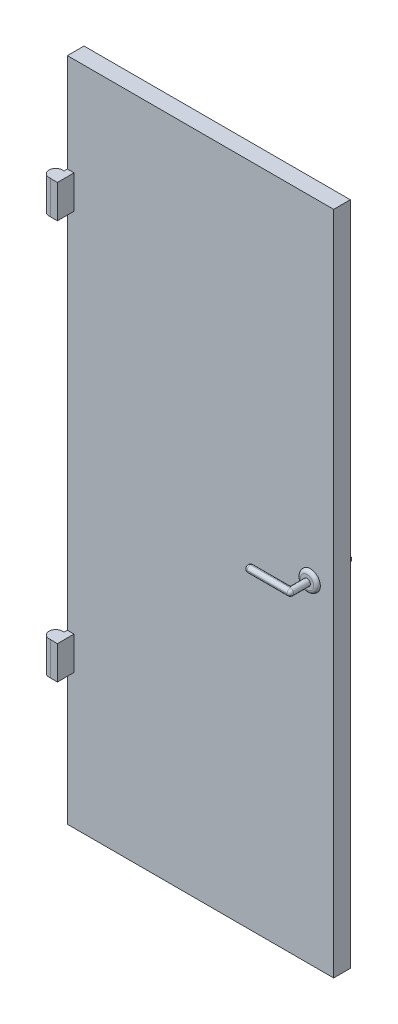
ISO-10303-21;
HEADER;
FILE_DESCRIPTION(('STEP AP214'),'2;1');
FILE_NAME('part.step','',(''),(''),'','','');
FILE_SCHEMA(('AUTOMOTIVE_DESIGN { 1 0 10303 214 1 1 1 1 }'));
ENDSEC;
DATA;
#1=APPLICATION_CONTEXT('core data for automotive mechanical design processes');
#2=APPLICATION_PROTOCOL_DEFINITION('international standard','automotive_design',2000,#1);
#3=PRODUCT_CONTEXT('',#1,'mechanical');
#4=PRODUCT('Part','Part','',(#3));
#5=PRODUCT_RELATED_PRODUCT_CATEGORY('part','',(#4));
#6=PRODUCT_DEFINITION_FORMATION('','',#4);
#7=PRODUCT_DEFINITION_CONTEXT('part definition',#1,'design');
#8=PRODUCT_DEFINITION('design','',#6,#7);
#9=PRODUCT_DEFINITION_SHAPE('','',#8);
#10=(LENGTH_UNIT() NAMED_UNIT(*) SI_UNIT(.MILLI.,.METRE.));
#11=(NAMED_UNIT(*) PLANE_ANGLE_UNIT() SI_UNIT($,.RADIAN.));
#12=(NAMED_UNIT(*) SI_UNIT($,.STERADIAN.) SOLID_ANGLE_UNIT());
#13=UNCERTAINTY_MEASURE_WITH_UNIT(LENGTH_MEASURE(1.E-05),#10,'distance_accuracy_value','');
#14=(GEOMETRIC_REPRESENTATION_CONTEXT(3) GLOBAL_UNCERTAINTY_ASSIGNED_CONTEXT((#13)) GLOBAL_UNIT_ASSIGNED_CONTEXT((#10,
#11,#12)) REPRESENTATION_CONTEXT('',''));
#15=CARTESIAN_POINT('',(0.,0.,0.));
#16=DIRECTION('',(0.,0.,1.));
#17=DIRECTION('',(1.,0.,0.));
#18=AXIS2_PLACEMENT_3D('',#15,#16,#17);
#19=CARTESIAN_POINT('',(0.,2000.,50.0000000000071));
#20=DIRECTION('',(-1.,0.,0.));
#21=DIRECTION('',(0.,0.,1.));
#22=AXIS2_PLACEMENT_3D('',#19,#20,#21);
#23=PLANE('',#22);
#24=DIRECTION('',(0.,0.,-1.));
#25=VECTOR('',#24,1.);
#26=CARTESIAN_POINT('',(0.,2000.,50.0000000000071));
#27=LINE('',#26,#25);
#28=CARTESIAN_POINT('',(0.,2000.,50.0000000000071));
#29=VERTEX_POINT('',#28);
#30=CARTESIAN_POINT('',(0.,2000.,7.105427357601E-12));
#31=VERTEX_POINT('',#30);
#32=EDGE_CURVE('E362',#29,#31,#27,.T.);
#33=ORIENTED_EDGE('',*,*,#32,.T.);
#34=DIRECTION('',(0.,1.,0.));
#35=VECTOR('',#34,1.);
#36=CARTESIAN_POINT('',(0.,2000.,7.105427357601E-12));
#37=LINE('',#36,#35);
#38=CARTESIAN_POINT('',(0.,0.,7.105427357601E-12));
#39=VERTEX_POINT('',#38);
#40=EDGE_CURVE('E354',#39,#31,#37,.T.);
#41=ORIENTED_EDGE('',*,*,#40,.F.);
#42=DIRECTION('',(0.,0.,-1.));
#43=VECTOR('',#42,1.);
#44=CARTESIAN_POINT('',(0.,0.,50.0000000000071));
#45=LINE('',#44,#43);
#46=CARTESIAN_POINT('',(0.,0.,50.0000000000071));
#47=VERTEX_POINT('',#46);
#48=EDGE_CURVE('E366',#47,#39,#45,.T.);
#49=ORIENTED_EDGE('',*,*,#48,.F.);
#50=DIRECTION('',(0.,1.,0.));
#51=VECTOR('',#50,1.);
#52=CARTESIAN_POINT('',(0.,2000.,50.0000000000071));
#53=LINE('',#52,#51);
#54=CARTESIAN_POINT('',(0.,405.,49.9999999999932));
#55=VERTEX_POINT('',#54);
#56=EDGE_CURVE('E337',#47,#55,#53,.T.);
#57=ORIENTED_EDGE('',*,*,#56,.T.);
#58=DIRECTION('',(0.,0.,-1.));
#59=VECTOR('',#58,1.);
#60=CARTESIAN_POINT('',(0.,405.,99.9999999999932));
#61=LINE('',#60,#59);
#62=CARTESIAN_POINT('',(0.,405.,60.6350832689759));
#63=VERTEX_POINT('',#62);
#64=EDGE_CURVE('E241',#63,#55,#61,.T.);
#65=ORIENTED_EDGE('',*,*,#64,.F.);
#66=DIRECTION('',(0.,-1.,0.));
#67=VECTOR('',#66,1.);
#68=CARTESIAN_POINT('',(0.,505.,60.6350832689759));
#69=LINE('',#68,#67);
#70=CARTESIAN_POINT('',(0.,505.,60.6350832689759));
#71=VERTEX_POINT('',#70);
#72=EDGE_CURVE('E211',#63,#71,#69,.F.);
#73=ORIENTED_EDGE('',*,*,#72,.T.);
#74=DIRECTION('',(0.,0.,-1.));
#75=VECTOR('',#74,1.);
#76=CARTESIAN_POINT('',(0.,505.,99.9999999999932));
#77=LINE('',#76,#75);
#78=CARTESIAN_POINT('',(0.,505.,49.9999999999932));
#79=VERTEX_POINT('',#78);
#80=EDGE_CURVE('E220',#71,#79,#77,.T.);
#81=ORIENTED_EDGE('',*,*,#80,.T.);
#82=CARTESIAN_POINT('',(0.,1605.,50.0000000000142));
#83=VERTEX_POINT('',#82);
#84=EDGE_CURVE('E342',#79,#83,#53,.T.);
#85=ORIENTED_EDGE('',*,*,#84,.T.);
#86=DIRECTION('',(0.,0.,-1.));
#87=VECTOR('',#86,1.);
#88=CARTESIAN_POINT('',(0.,1605.,100.000000000014));
#89=LINE('',#88,#87);
#90=CARTESIAN_POINT('',(0.,1605.,60.635083268997));
#91=VERTEX_POINT('',#90);
#92=EDGE_CURVE('E300',#91,#83,#89,.T.);
#93=ORIENTED_EDGE('',*,*,#92,.F.);
#94=DIRECTION('',(0.,-1.,0.));
#95=VECTOR('',#94,1.);
#96=CARTESIAN_POINT('',(0.,1705.,60.635083268997));
#97=LINE('',#96,#95);
#98=CARTESIAN_POINT('',(0.,1705.,60.635083268997));
#99=VERTEX_POINT('',#98);
#100=EDGE_CURVE('E256',#91,#99,#97,.F.);
#101=ORIENTED_EDGE('',*,*,#100,.T.);
#102=DIRECTION('',(0.,0.,-1.));
#103=VECTOR('',#102,1.);
#104=CARTESIAN_POINT('',(0.,1705.,100.000000000014));
#105=LINE('',#104,#103);
#106=CARTESIAN_POINT('',(0.,1705.,50.0000000000142));
#107=VERTEX_POINT('',#106);
#108=EDGE_CURVE('E278',#99,#107,#105,.T.);
#109=ORIENTED_EDGE('',*,*,#108,.T.);
#110=EDGE_CURVE('E336',#107,#29,#53,.T.);
#111=ORIENTED_EDGE('',*,*,#110,.T.);
#112=EDGE_LOOP('',(#33,#41,#49,#57,#65,#73,#81,#85,#93,#101,#109,#111));
#113=FACE_BOUND('',#112,.T.);
#114=ADVANCED_FACE('F41',(#113),#23,.T.);
#115=CARTESIAN_POINT('',(0.,505.,99.9999999999932));
#116=VERTEX_POINT('',#115);
#117=CARTESIAN_POINT('',(0.,505.,99.3649167310388));
#118=VERTEX_POINT('',#117);
#119=EDGE_CURVE('E217',#116,#118,#77,.T.);
#120=ORIENTED_EDGE('',*,*,#119,.T.);
#121=DIRECTION('',(0.,-1.,0.));
#122=VECTOR('',#121,1.);
#123=CARTESIAN_POINT('',(0.,505.,99.3649167310388));
#124=LINE('',#123,#122);
#125=CARTESIAN_POINT('',(0.,405.,99.3649167310388));
#126=VERTEX_POINT('',#125);
#127=EDGE_CURVE('E203',#118,#126,#124,.T.);
#128=ORIENTED_EDGE('',*,*,#127,.T.);
#129=CARTESIAN_POINT('',(0.,405.,99.9999999999932));
#130=VERTEX_POINT('',#129);
#131=EDGE_CURVE('E242',#130,#126,#61,.T.);
#132=ORIENTED_EDGE('',*,*,#131,.F.);
#133=DIRECTION('',(0.,1.,0.));
#134=VECTOR('',#133,1.);
#135=CARTESIAN_POINT('',(0.,405.,99.9999999999932));
#136=LINE('',#135,#134);
#137=EDGE_CURVE('E225',#130,#116,#136,.T.);
#138=ORIENTED_EDGE('',*,*,#137,.T.);
#139=EDGE_LOOP('',(#120,#128,#132,#138));
#140=FACE_BOUND('',#139,.T.);
#141=ADVANCED_FACE('F223',(#140),#23,.T.);
#142=CARTESIAN_POINT('',(0.,1705.,100.000000000014));
#143=VERTEX_POINT('',#142);
#144=CARTESIAN_POINT('',(0.,1705.,99.3649167310599));
#145=VERTEX_POINT('',#144);
#146=EDGE_CURVE('E289',#143,#145,#105,.T.);
#147=ORIENTED_EDGE('',*,*,#146,.T.);
#148=DIRECTION('',(0.,-1.,0.));
#149=VECTOR('',#148,1.);
#150=CARTESIAN_POINT('',(0.,1705.,99.3649167310599));
#151=LINE('',#150,#149);
#152=CARTESIAN_POINT('',(0.,1605.,99.3649167310599));
#153=VERTEX_POINT('',#152);
#154=EDGE_CURVE('E250',#145,#153,#151,.T.);
#155=ORIENTED_EDGE('',*,*,#154,.T.);
#156=CARTESIAN_POINT('',(0.,1605.,100.000000000014));
#157=VERTEX_POINT('',#156);
#158=EDGE_CURVE('E301',#157,#153,#89,.T.);
#159=ORIENTED_EDGE('',*,*,#158,.F.);
#160=DIRECTION('',(0.,1.,0.));
#161=VECTOR('',#160,1.);
#162=CARTESIAN_POINT('',(0.,1605.,100.000000000014));
#163=LINE('',#162,#161);
#164=EDGE_CURVE('E261',#157,#143,#163,.T.);
#165=ORIENTED_EDGE('',*,*,#164,.T.);
#166=EDGE_LOOP('',(#147,#155,#159,#165));
#167=FACE_BOUND('',#166,.T.);
#168=ADVANCED_FACE('F509',(#167),#23,.T.);
#169=CARTESIAN_POINT('',(0.,0.,7.105427357601E-12));
#170=DIRECTION('',(0.,0.,-1.));
#171=DIRECTION('',(-1.,0.,0.));
#172=AXIS2_PLACEMENT_3D('',#169,#170,#171);
#173=PLANE('',#172);
#174=CARTESIAN_POINT('',(730.000000000004,1000.,0.));
#175=DIRECTION('',(0.,0.,-1.));
#176=DIRECTION('',(-1.,0.,0.));
#177=AXIS2_PLACEMENT_3D('',#174,#175,#176);
#178=CIRCLE('',#177,30.0000000000001);
#179=CARTESIAN_POINT('',(700.000000000004,1000.,0.));
#180=VERTEX_POINT('',#179);
#181=EDGE_CURVE('E321',#180,#180,#178,.T.);
#182=ORIENTED_EDGE('',*,*,#181,.F.);
#183=EDGE_LOOP('',(#182));
#184=FACE_BOUND('',#183,.T.);
#185=ORIENTED_EDGE('',*,*,#40,.T.);
#186=DIRECTION('',(1.,0.,0.));
#187=VECTOR('',#186,1.);
#188=CARTESIAN_POINT('',(800.000000000004,2000.,7.105427357601E-12));
#189=LINE('',#188,#187);
#190=CARTESIAN_POINT('',(800.000000000004,2000.,7.105427357601E-12));
#191=VERTEX_POINT('',#190);
#192=EDGE_CURVE('E332',#31,#191,#189,.T.);
#193=ORIENTED_EDGE('',*,*,#192,.T.);
#194=DIRECTION('',(0.,-1.,0.));
#195=VECTOR('',#194,1.);
#196=CARTESIAN_POINT('',(800.000000000004,2000.,7.105427357601E-12));
#197=LINE('',#196,#195);
#198=CARTESIAN_POINT('',(800.000000000004,0.,7.105427357601E-12));
#199=VERTEX_POINT('',#198);
#200=EDGE_CURVE('E325',#191,#199,#197,.T.);
#201=ORIENTED_EDGE('',*,*,#200,.T.);
#202=DIRECTION('',(-1.,0.,0.));
#203=VECTOR('',#202,1.);
#204=CARTESIAN_POINT('',(800.000000000004,0.,7.105427357601E-12));
#205=LINE('',#204,#203);
#206=EDGE_CURVE('E350',#199,#39,#205,.T.);
#207=ORIENTED_EDGE('',*,*,#206,.T.);
#208=EDGE_LOOP('',(#185,#193,#201,#207));
#209=FACE_BOUND('',#208,.T.);
#210=ADVANCED_FACE('F516',(#184,#209),#173,.T.);
#211=CARTESIAN_POINT('',(800.000000000004,2000.,50.0000000000071));
#212=DIRECTION('',(1.,0.,0.));
#213=DIRECTION('',(0.,0.,-1.));
#214=AXIS2_PLACEMENT_3D('',#211,#212,#213);
#215=PLANE('',#214);
#216=ORIENTED_EDGE('',*,*,#200,.F.);
#217=DIRECTION('',(0.,0.,-1.));
#218=VECTOR('',#217,1.);
#219=CARTESIAN_POINT('',(800.000000000004,2000.,50.0000000000071));
#220=LINE('',#219,#218);
#221=CARTESIAN_POINT('',(800.000000000004,2000.,50.0000000000071));
#222=VERTEX_POINT('',#221);
#223=EDGE_CURVE('E320',#222,#191,#220,.T.);
#224=ORIENTED_EDGE('',*,*,#223,.F.);
#225=DIRECTION('',(0.,-1.,0.));
#226=VECTOR('',#225,1.);
#227=CARTESIAN_POINT('',(800.000000000004,2000.,50.0000000000071));
#228=LINE('',#227,#226);
#229=CARTESIAN_POINT('',(800.000000000004,0.,50.0000000000071));
#230=VERTEX_POINT('',#229);
#231=EDGE_CURVE('E327',#222,#230,#228,.T.);
#232=ORIENTED_EDGE('',*,*,#231,.T.);
#233=DIRECTION('',(0.,0.,-1.));
#234=VECTOR('',#233,1.);
#235=CARTESIAN_POINT('',(800.000000000004,0.,50.0000000000071));
#236=LINE('',#235,#234);
#237=EDGE_CURVE('E346',#230,#199,#236,.T.);
#238=ORIENTED_EDGE('',*,*,#237,.T.);
#239=EDGE_LOOP('',(#216,#224,#232,#238));
#240=FACE_BOUND('',#239,.T.);
#241=ADVANCED_FACE('F521',(#240),#215,.T.);
#242=CARTESIAN_POINT('',(800.000000000004,2000.,50.0000000000071));
#243=DIRECTION('',(0.,1.,0.));
#244=DIRECTION('',(0.,0.,1.));
#245=AXIS2_PLACEMENT_3D('',#242,#243,#244);
#246=PLANE('',#245);
#247=ORIENTED_EDGE('',*,*,#192,.F.);
#248=ORIENTED_EDGE('',*,*,#32,.F.);
#249=DIRECTION('',(1.,0.,0.));
#250=VECTOR('',#249,1.);
#251=CARTESIAN_POINT('',(800.000000000004,2000.,50.0000000000071));
#252=LINE('',#251,#250);
#253=EDGE_CURVE('E341',#29,#222,#252,.T.);
#254=ORIENTED_EDGE('',*,*,#253,.T.);
#255=ORIENTED_EDGE('',*,*,#223,.T.);
#256=EDGE_LOOP('',(#247,#248,#254,#255));
#257=FACE_BOUND('',#256,.T.);
#258=ADVANCED_FACE('F563',(#257),#246,.T.);
#259=CARTESIAN_POINT('',(800.000000000004,0.,50.0000000000071));
#260=DIRECTION('',(0.,-1.,0.));
#261=DIRECTION('',(0.,0.,-1.));
#262=AXIS2_PLACEMENT_3D('',#259,#260,#261);
#263=PLANE('',#262);
#264=ORIENTED_EDGE('',*,*,#206,.F.);
#265=ORIENTED_EDGE('',*,*,#237,.F.);
#266=DIRECTION('',(-1.,0.,0.));
#267=VECTOR('',#266,1.);
#268=CARTESIAN_POINT('',(800.000000000004,0.,50.0000000000071));
#269=LINE('',#268,#267);
#270=EDGE_CURVE('E331',#230,#47,#269,.T.);
#271=ORIENTED_EDGE('',*,*,#270,.T.);
#272=ORIENTED_EDGE('',*,*,#48,.T.);
#273=EDGE_LOOP('',(#264,#265,#271,#272));
#274=FACE_BOUND('',#273,.T.);
#275=ADVANCED_FACE('F556',(#274),#263,.T.);
#276=CARTESIAN_POINT('',(0.,0.,50.0000000000071));
#277=DIRECTION('',(0.,0.,-1.));
#278=DIRECTION('',(-1.,0.,0.));
#279=AXIS2_PLACEMENT_3D('',#276,#277,#278);
#280=PLANE('',#279);
#281=CARTESIAN_POINT('',(730.000000000004,1000.,50.0000000000141));
#282=DIRECTION('',(0.,0.,-1.));
#283=DIRECTION('',(-1.,0.,0.));
#284=AXIS2_PLACEMENT_3D('',#281,#282,#283);
#285=CIRCLE('',#284,30.0000000000001);
#286=CARTESIAN_POINT('',(700.000000000004,1000.,50.0000000000141));
#287=VERTEX_POINT('',#286);
#288=EDGE_CURVE('E310',#287,#287,#285,.T.);
#289=ORIENTED_EDGE('',*,*,#288,.T.);
#290=EDGE_LOOP('',(#289));
#291=FACE_BOUND('',#290,.T.);
#292=DIRECTION('',(0.,-1.,0.));
#293=VECTOR('',#292,1.);
#294=CARTESIAN_POINT('',(20.0000000000031,405.,49.9999999999932));
#295=LINE('',#294,#293);
#296=CARTESIAN_POINT('',(20.0000000000031,505.,50.0000000000071));
#297=VERTEX_POINT('',#296);
#298=CARTESIAN_POINT('',(20.0000000000031,405.,49.9999999999932));
#299=VERTEX_POINT('',#298);
#300=EDGE_CURVE('E67',#297,#299,#295,.T.);
#301=ORIENTED_EDGE('',*,*,#300,.T.);
#302=DIRECTION('',(-1.,0.,0.));
#303=VECTOR('',#302,1.);
#304=CARTESIAN_POINT('',(0.,405.,49.9999999999932));
#305=LINE('',#304,#303);
#306=EDGE_CURVE('E545',#299,#55,#305,.T.);
#307=ORIENTED_EDGE('',*,*,#306,.T.);
#308=ORIENTED_EDGE('',*,*,#56,.F.);
#309=ORIENTED_EDGE('',*,*,#270,.F.);
#310=ORIENTED_EDGE('',*,*,#231,.F.);
#311=ORIENTED_EDGE('',*,*,#253,.F.);
#312=ORIENTED_EDGE('',*,*,#110,.F.);
#313=DIRECTION('',(1.,0.,0.));
#314=VECTOR('',#313,1.);
#315=CARTESIAN_POINT('',(0.,1705.,50.0000000000142));
#316=LINE('',#315,#314);
#317=CARTESIAN_POINT('',(20.0000000000031,1705.,50.0000000000071));
#318=VERTEX_POINT('',#317);
#319=EDGE_CURVE('E266',#107,#318,#316,.T.);
#320=ORIENTED_EDGE('',*,*,#319,.T.);
#321=DIRECTION('',(0.,-1.,0.));
#322=VECTOR('',#321,1.);
#323=CARTESIAN_POINT('',(20.0000000000031,1605.,50.0000000000142));
#324=LINE('',#323,#322);
#325=CARTESIAN_POINT('',(20.0000000000031,1605.,50.0000000000142));
#326=VERTEX_POINT('',#325);
#327=EDGE_CURVE('E282',#318,#326,#324,.T.);
#328=ORIENTED_EDGE('',*,*,#327,.T.);
#329=DIRECTION('',(-1.,0.,0.));
#330=VECTOR('',#329,1.);
#331=CARTESIAN_POINT('',(0.,1605.,50.0000000000142));
#332=LINE('',#331,#330);
#333=EDGE_CURVE('E260',#326,#83,#332,.T.);
#334=ORIENTED_EDGE('',*,*,#333,.T.);
#335=ORIENTED_EDGE('',*,*,#84,.F.);
#336=DIRECTION('',(1.,0.,0.));
#337=VECTOR('',#336,1.);
#338=CARTESIAN_POINT('',(0.,505.,49.9999999999932));
#339=LINE('',#338,#337);
#340=EDGE_CURVE('E236',#79,#297,#339,.T.);
#341=ORIENTED_EDGE('',*,*,#340,.T.);
#342=EDGE_LOOP('',(#301,#307,#308,#309,#310,#311,#312,#320,#328,#334,#335,#341));
#343=FACE_BOUND('',#342,.T.);
#344=ADVANCED_FACE('F548',(#291,#343),#280,.F.);
#345=CARTESIAN_POINT('',(730.000000000004,1000.,-9.99999999999992));
#346=DIRECTION('',(0.,0.,-1.));
#347=DIRECTION('',(-1.,0.,0.));
#348=AXIS2_PLACEMENT_3D('',#345,#346,#347);
#349=PLANE('',#348);
#350=CARTESIAN_POINT('',(730.000000000004,1000.,-9.99999999999992));
#351=DIRECTION('',(0.,0.,-1.));
#352=DIRECTION('',(-1.,0.,0.));
#353=AXIS2_PLACEMENT_3D('',#350,#351,#352);
#354=CIRCLE('',#353,20.0000000000001);
#355=CARTESIAN_POINT('',(710.000000000004,1000.,-9.99999999999992));
#356=VERTEX_POINT('',#355);
#357=EDGE_CURVE('E373',#356,#356,#354,.T.);
#358=ORIENTED_EDGE('',*,*,#357,.T.);
#359=EDGE_LOOP('',(#358));
#360=FACE_BOUND('',#359,.T.);
#361=CARTESIAN_POINT('',(730.000000000004,1000.,-9.99999999999992));
#362=DIRECTION('',(0.,0.,-1.));
#363=DIRECTION('',(-1.,0.,0.));
#364=AXIS2_PLACEMENT_3D('',#361,#362,#363);
#365=CIRCLE('',#364,9.99999999999998);
#366=CARTESIAN_POINT('',(720.000000000004,1000.,-9.99999999999992));
#367=VERTEX_POINT('',#366);
#368=EDGE_CURVE('E315',#367,#367,#365,.T.);
#369=ORIENTED_EDGE('',*,*,#368,.F.);
#370=EDGE_LOOP('',(#369));
#371=FACE_BOUND('',#370,.T.);
#372=ADVANCED_FACE('F628',(#360,#371),#349,.T.);
#373=CARTESIAN_POINT('',(730.000000000004,1000.,-49.9999999999999));
#374=DIRECTION('',(0.,0.,1.));
#375=DIRECTION('',(1.,0.,0.));
#376=AXIS2_PLACEMENT_3D('',#373,#374,#375);
#377=CYLINDRICAL_SURFACE('',#376,9.99999999999998);
#378=CARTESIAN_POINT('',(730.000000000004,1000.,-59.9999999999999));
#379=DIRECTION('',(0.707106781186547,0.,0.707106781186548));
#380=DIRECTION('',(-0.707106781186548,0.,0.707106781186547));
#381=AXIS2_PLACEMENT_3D('',#378,#379,#380);
#382=ELLIPSE('',#381,14.1421356237309,9.99999999999999);
#383=CARTESIAN_POINT('',(730.000000000004,1010.,-59.9999999999999));
#384=VERTEX_POINT('',#383);
#385=CARTESIAN_POINT('',(720.000000000004,1000.,-49.9999999999999));
#386=VERTEX_POINT('',#385);
#387=EDGE_CURVE('E377',#384,#386,#382,.T.);
#388=ORIENTED_EDGE('',*,*,#387,.T.);
#389=CARTESIAN_POINT('',(730.000000000004,1000.,-59.9999999999999));
#390=DIRECTION('',(0.707106781186547,0.,0.707106781186548));
#391=DIRECTION('',(-0.707106781186548,0.,0.707106781186547));
#392=AXIS2_PLACEMENT_3D('',#389,#390,#391);
#393=ELLIPSE('',#392,14.1421356237309,9.99999999999999);
#394=CARTESIAN_POINT('',(730.000000000004,990.,-59.9999999999999));
#395=VERTEX_POINT('',#394);
#396=EDGE_CURVE('E381',#386,#395,#393,.T.);
#397=ORIENTED_EDGE('',*,*,#396,.T.);
#398=CARTESIAN_POINT('',(730.000000000004,1000.,-59.9999999999999));
#399=DIRECTION('',(0.,0.,1.));
#400=DIRECTION('',(1.,0.,0.));
#401=AXIS2_PLACEMENT_3D('',#398,#399,#400);
#402=CIRCLE('',#401,9.99999999999998);
#403=EDGE_CURVE('E319',#395,#384,#402,.T.);
#404=ORIENTED_EDGE('',*,*,#403,.T.);
#405=EDGE_LOOP('',(#388,#397,#404));
#406=FACE_BOUND('',#405,.T.);
#407=ORIENTED_EDGE('',*,*,#368,.T.);
#408=EDGE_LOOP('',(#407));
#409=FACE_BOUND('',#408,.T.);
#410=ADVANCED_FACE('F624',(#406,#409),#377,.T.);
#411=CARTESIAN_POINT('',(610.000000000004,1000.,-59.9999999999999));
#412=DIRECTION('',(0.,0.,-1.));
#413=DIRECTION('',(-1.,0.,0.));
#414=AXIS2_PLACEMENT_3D('',#411,#412,#413);
#415=SPHERICAL_SURFACE('',#414,10.);
#416=CARTESIAN_POINT('',(610.000000000004,1000.,-59.9999999999999));
#417=DIRECTION('',(1.,0.,0.));
#418=DIRECTION('',(0.,0.,-1.));
#419=AXIS2_PLACEMENT_3D('',#416,#417,#418);
#420=CIRCLE('',#419,10.);
#421=CARTESIAN_POINT('',(610.000000000004,990.,-59.9999999999999));
#422=VERTEX_POINT('',#421);
#423=CARTESIAN_POINT('',(610.000000000004,1000.,-69.9999999999999));
#424=VERTEX_POINT('',#423);
#425=EDGE_CURVE('E326',#422,#424,#420,.T.);
#426=ORIENTED_EDGE('',*,*,#425,.F.);
#427=CARTESIAN_POINT('',(610.000000000004,1000.,-59.9999999999999));
#428=DIRECTION('',(0.,0.,1.));
#429=DIRECTION('',(1.,0.,0.));
#430=AXIS2_PLACEMENT_3D('',#427,#428,#429);
#431=CIRCLE('',#430,9.99999999999979);
#432=CARTESIAN_POINT('',(610.000000000004,1010.,-59.9999999999999));
#433=VERTEX_POINT('',#432);
#434=EDGE_CURVE('E407',#433,#422,#431,.T.);
#435=ORIENTED_EDGE('',*,*,#434,.F.);
#436=CARTESIAN_POINT('',(610.000000000004,1000.,-59.9999999999999));
#437=DIRECTION('',(1.,0.,0.));
#438=DIRECTION('',(0.,0.,-1.));
#439=AXIS2_PLACEMENT_3D('',#436,#437,#438);
#440=CIRCLE('',#439,10.);
#441=EDGE_CURVE('E403',#424,#433,#440,.T.);
#442=ORIENTED_EDGE('',*,*,#441,.F.);
#443=EDGE_LOOP('',(#426,#435,#442));
#444=FACE_BOUND('',#443,.T.);
#445=ADVANCED_FACE('F627',(#444),#415,.T.);
#446=CARTESIAN_POINT('',(730.000000000004,1000.,-59.9999999999999));
#447=DIRECTION('',(1.,0.,0.));
#448=DIRECTION('',(0.,1.,0.));
#449=AXIS2_PLACEMENT_3D('',#446,#447,#448);
#450=CYLINDRICAL_SURFACE('',#449,10.);
#451=CARTESIAN_POINT('',(730.000000000004,1000.,-59.9999999999999));
#452=DIRECTION('',(1.,0.,0.));
#453=DIRECTION('',(0.,0.,-1.));
#454=AXIS2_PLACEMENT_3D('',#451,#452,#453);
#455=CIRCLE('',#454,10.);
#456=CARTESIAN_POINT('',(730.000000000004,1000.,-69.9999999999999));
#457=VERTEX_POINT('',#456);
#458=EDGE_CURVE('E418',#395,#457,#455,.T.);
#459=ORIENTED_EDGE('',*,*,#458,.F.);
#460=DIRECTION('',(-1.,0.,0.));
#461=VECTOR('',#460,1.);
#462=CARTESIAN_POINT('',(730.000000000004,990.,-59.9999999999999));
#463=LINE('',#462,#461);
#464=EDGE_CURVE('E414',#422,#395,#463,.F.);
#465=ORIENTED_EDGE('',*,*,#464,.F.);
#466=ORIENTED_EDGE('',*,*,#425,.T.);
#467=DIRECTION('',(-1.,0.,0.));
#468=VECTOR('',#467,1.);
#469=CARTESIAN_POINT('',(610.000000000004,1000.,-69.9999999999999));
#470=LINE('',#469,#468);
#471=EDGE_CURVE('E399',#457,#424,#470,.T.);
#472=ORIENTED_EDGE('',*,*,#471,.F.);
#473=EDGE_LOOP('',(#459,#465,#466,#472));
#474=FACE_BOUND('',#473,.T.);
#475=ADVANCED_FACE('F663',(#474),#450,.T.);
#476=CARTESIAN_POINT('',(730.000000000004,1000.,-59.9999999999999));
#477=DIRECTION('',(0.,0.,-1.));
#478=DIRECTION('',(-1.,0.,0.));
#479=AXIS2_PLACEMENT_3D('',#476,#477,#478);
#480=SPHERICAL_SURFACE('',#479,10.);
#481=ORIENTED_EDGE('',*,*,#403,.F.);
#482=ORIENTED_EDGE('',*,*,#458,.T.);
#483=CARTESIAN_POINT('',(730.000000000004,1000.,-59.9999999999999));
#484=DIRECTION('',(-1.,0.,0.));
#485=DIRECTION('',(0.,0.,1.));
#486=AXIS2_PLACEMENT_3D('',#483,#484,#485);
#487=CIRCLE('',#486,10.);
#488=EDGE_CURVE('E395',#384,#457,#487,.T.);
#489=ORIENTED_EDGE('',*,*,#488,.F.);
#490=EDGE_LOOP('',(#481,#482,#489));
#491=FACE_BOUND('',#490,.T.);
#492=ADVANCED_FACE('F659',(#491),#480,.T.);
#493=CARTESIAN_POINT('',(730.000000000004,1000.,-59.9999999999999));
#494=DIRECTION('',(-1.,0.,0.));
#495=DIRECTION('',(0.,-1.,0.));
#496=AXIS2_PLACEMENT_3D('',#493,#494,#495);
#497=CYLINDRICAL_SURFACE('',#496,10.);
#498=CARTESIAN_POINT('',(610.000000000004,1000.,-59.9999999999999));
#499=DIRECTION('',(-1.,0.,0.));
#500=DIRECTION('',(0.,0.,1.));
#501=AXIS2_PLACEMENT_3D('',#498,#499,#500);
#502=CIRCLE('',#501,10.);
#503=CARTESIAN_POINT('',(610.000000000004,1000.,-49.9999999999999));
#504=VERTEX_POINT('',#503);
#505=EDGE_CURVE('E411',#422,#504,#502,.T.);
#506=ORIENTED_EDGE('',*,*,#505,.F.);
#507=ORIENTED_EDGE('',*,*,#464,.T.);
#508=ORIENTED_EDGE('',*,*,#396,.F.);
#509=DIRECTION('',(-1.,0.,0.));
#510=VECTOR('',#509,1.);
#511=CARTESIAN_POINT('',(730.000000000004,1000.,-49.9999999999999));
#512=LINE('',#511,#510);
#513=EDGE_CURVE('E392',#504,#386,#512,.F.);
#514=ORIENTED_EDGE('',*,*,#513,.F.);
#515=EDGE_LOOP('',(#506,#507,#508,#514));
#516=FACE_BOUND('',#515,.T.);
#517=ADVANCED_FACE('F655',(#516),#497,.T.);
#518=CARTESIAN_POINT('',(610.000000000004,1000.,-59.9999999999999));
#519=DIRECTION('',(0.,0.,-1.));
#520=DIRECTION('',(-1.,0.,0.));
#521=AXIS2_PLACEMENT_3D('',#518,#519,#520);
#522=SPHERICAL_SURFACE('',#521,10.);
#523=ORIENTED_EDGE('',*,*,#434,.T.);
#524=ORIENTED_EDGE('',*,*,#505,.T.);
#525=CARTESIAN_POINT('',(610.000000000004,1000.,-59.9999999999999));
#526=DIRECTION('',(1.,0.,0.));
#527=DIRECTION('',(0.,0.,-1.));
#528=AXIS2_PLACEMENT_3D('',#525,#526,#527);
#529=CIRCLE('',#528,10.);
#530=EDGE_CURVE('E388',#433,#504,#529,.T.);
#531=ORIENTED_EDGE('',*,*,#530,.F.);
#532=EDGE_LOOP('',(#523,#524,#531));
#533=FACE_BOUND('',#532,.T.);
#534=ADVANCED_FACE('F651',(#533),#522,.T.);
#535=CARTESIAN_POINT('',(730.000000000004,1000.,-59.9999999999999));
#536=DIRECTION('',(-1.,0.,0.));
#537=DIRECTION('',(0.,-1.,0.));
#538=AXIS2_PLACEMENT_3D('',#535,#536,#537);
#539=CYLINDRICAL_SURFACE('',#538,10.);
#540=ORIENTED_EDGE('',*,*,#471,.T.);
#541=ORIENTED_EDGE('',*,*,#441,.T.);
#542=DIRECTION('',(1.,0.,0.));
#543=VECTOR('',#542,1.);
#544=CARTESIAN_POINT('',(610.000000000004,1010.,-59.9999999999999));
#545=LINE('',#544,#543);
#546=EDGE_CURVE('E314',#384,#433,#545,.F.);
#547=ORIENTED_EDGE('',*,*,#546,.F.);
#548=ORIENTED_EDGE('',*,*,#488,.T.);
#549=EDGE_LOOP('',(#540,#541,#547,#548));
#550=FACE_BOUND('',#549,.T.);
#551=ADVANCED_FACE('F647',(#550),#539,.T.);
#552=CARTESIAN_POINT('',(730.000000000004,1000.,-59.9999999999999));
#553=DIRECTION('',(1.,0.,0.));
#554=DIRECTION('',(0.,1.,0.));
#555=AXIS2_PLACEMENT_3D('',#552,#553,#554);
#556=CYLINDRICAL_SURFACE('',#555,10.);
#557=ORIENTED_EDGE('',*,*,#530,.T.);
#558=ORIENTED_EDGE('',*,*,#513,.T.);
#559=ORIENTED_EDGE('',*,*,#387,.F.);
#560=ORIENTED_EDGE('',*,*,#546,.T.);
#561=EDGE_LOOP('',(#557,#558,#559,#560));
#562=FACE_BOUND('',#561,.T.);
#563=ADVANCED_FACE('F644',(#562),#556,.T.);
#564=CARTESIAN_POINT('',(730.000000000004,1000.,0.));
#565=DIRECTION('',(0.,0.,-1.));
#566=DIRECTION('',(-1.,0.,0.));
#567=AXIS2_PLACEMENT_3D('',#564,#565,#566);
#568=TOROIDAL_SURFACE('',#567,20.0000000000001,10.);
#569=ORIENTED_EDGE('',*,*,#181,.T.);
#570=EDGE_LOOP('',(#569));
#571=FACE_BOUND('',#570,.T.);
#572=ORIENTED_EDGE('',*,*,#357,.F.);
#573=EDGE_LOOP('',(#572));
#574=FACE_BOUND('',#573,.T.);
#575=ADVANCED_FACE('F622',(#571,#574),#568,.T.);
#576=CARTESIAN_POINT('',(730.000000000004,1000.,60.0000000000141));
#577=DIRECTION('',(0.,0.,1.));
#578=DIRECTION('',(-1.,0.,0.));
#579=AXIS2_PLACEMENT_3D('',#576,#577,#578);
#580=PLANE('',#579);
#581=CARTESIAN_POINT('',(730.000000000004,1000.,60.0000000000141));
#582=DIRECTION('',(0.,0.,1.));
#583=DIRECTION('',(1.,0.,0.));
#584=AXIS2_PLACEMENT_3D('',#581,#582,#583);
#585=CIRCLE('',#584,20.0000000000001);
#586=CARTESIAN_POINT('',(750.000000000004,1000.,60.0000000000141));
#587=VERTEX_POINT('',#586);
#588=EDGE_CURVE('E425',#587,#587,#585,.T.);
#589=ORIENTED_EDGE('',*,*,#588,.T.);
#590=EDGE_LOOP('',(#589));
#591=FACE_BOUND('',#590,.T.);
#592=CARTESIAN_POINT('',(730.000000000004,1000.,60.0000000000141));
#593=DIRECTION('',(0.,0.,-1.));
#594=DIRECTION('',(-1.,0.,0.));
#595=AXIS2_PLACEMENT_3D('',#592,#593,#594);
#596=CIRCLE('',#595,9.99999999999998);
#597=CARTESIAN_POINT('',(720.000000000004,1000.,60.0000000000141));
#598=VERTEX_POINT('',#597);
#599=EDGE_CURVE('E306',#598,#598,#596,.T.);
#600=ORIENTED_EDGE('',*,*,#599,.T.);
#601=EDGE_LOOP('',(#600));
#602=FACE_BOUND('',#601,.T.);
#603=ADVANCED_FACE('F619',(#591,#602),#580,.T.);
#604=CARTESIAN_POINT('',(730.000000000004,1000.,100.000000000014));
#605=DIRECTION('',(0.,0.,-1.));
#606=DIRECTION('',(-1.,0.,0.));
#607=AXIS2_PLACEMENT_3D('',#604,#605,#606);
#608=CYLINDRICAL_SURFACE('',#607,9.99999999999998);
#609=CARTESIAN_POINT('',(730.000000000004,1000.,110.000000000014));
#610=DIRECTION('',(0.,0.,-1.));
#611=DIRECTION('',(-1.,0.,0.));
#612=AXIS2_PLACEMENT_3D('',#609,#610,#611);
#613=CIRCLE('',#612,9.99999999999998);
#614=CARTESIAN_POINT('',(730.000000000004,1010.,110.000000000014));
#615=VERTEX_POINT('',#614);
#616=CARTESIAN_POINT('',(730.000000000004,990.,110.000000000014));
#617=VERTEX_POINT('',#616);
#618=EDGE_CURVE('E384',#615,#617,#613,.T.);
#619=ORIENTED_EDGE('',*,*,#618,.T.);
#620=CARTESIAN_POINT('',(730.000000000004,1000.,110.000000000014));
#621=DIRECTION('',(0.707106781186547,0.,-0.707106781186548));
#622=DIRECTION('',(0.707106781186548,0.,0.707106781186547));
#623=AXIS2_PLACEMENT_3D('',#620,#621,#622);
#624=ELLIPSE('',#623,14.1421356237309,9.99999999999999);
#625=CARTESIAN_POINT('',(720.000000000004,1000.,100.000000000014));
#626=VERTEX_POINT('',#625);
#627=EDGE_CURVE('E11',#617,#626,#624,.T.);
#628=ORIENTED_EDGE('',*,*,#627,.T.);
#629=CARTESIAN_POINT('',(730.000000000004,1000.,110.000000000014));
#630=DIRECTION('',(-0.707106781186547,0.,0.707106781186548));
#631=DIRECTION('',(-0.707106781186548,0.,-0.707106781186547));
#632=AXIS2_PLACEMENT_3D('',#629,#630,#631);
#633=ELLIPSE('',#632,14.1421356237309,9.99999999999999);
#634=EDGE_CURVE('E51',#626,#615,#633,.F.);
#635=ORIENTED_EDGE('',*,*,#634,.T.);
#636=EDGE_LOOP('',(#619,#628,#635));
#637=FACE_BOUND('',#636,.T.);
#638=ORIENTED_EDGE('',*,*,#599,.F.);
#639=EDGE_LOOP('',(#638));
#640=FACE_BOUND('',#639,.T.);
#641=ADVANCED_FACE('F487',(#637,#640),#608,.T.);
#642=CARTESIAN_POINT('',(610.000000000004,1000.,110.000000000014));
#643=DIRECTION('',(0.,0.,1.));
#644=DIRECTION('',(1.,0.,0.));
#645=AXIS2_PLACEMENT_3D('',#642,#643,#644);
#646=SPHERICAL_SURFACE('',#645,10.);
#647=CARTESIAN_POINT('',(610.000000000004,1000.,110.000000000014));
#648=DIRECTION('',(1.,0.,0.));
#649=DIRECTION('',(0.,0.,-1.));
#650=AXIS2_PLACEMENT_3D('',#647,#648,#649);
#651=CIRCLE('',#650,10.);
#652=CARTESIAN_POINT('',(610.000000000004,1000.,120.000000000014));
#653=VERTEX_POINT('',#652);
#654=CARTESIAN_POINT('',(610.000000000004,990.,110.000000000014));
#655=VERTEX_POINT('',#654);
#656=EDGE_CURVE('E45',#653,#655,#651,.T.);
#657=ORIENTED_EDGE('',*,*,#656,.F.);
#658=CARTESIAN_POINT('',(610.000000000004,1000.,110.000000000014));
#659=DIRECTION('',(1.,0.,0.));
#660=DIRECTION('',(0.,0.,-1.));
#661=AXIS2_PLACEMENT_3D('',#658,#659,#660);
#662=CIRCLE('',#661,10.);
#663=CARTESIAN_POINT('',(610.000000000004,1010.,110.000000000014));
#664=VERTEX_POINT('',#663);
#665=EDGE_CURVE('E453',#664,#653,#662,.T.);
#666=ORIENTED_EDGE('',*,*,#665,.F.);
#667=CARTESIAN_POINT('',(610.000000000004,1000.,110.000000000014));
#668=DIRECTION('',(0.,0.,-1.));
#669=DIRECTION('',(-1.,0.,0.));
#670=AXIS2_PLACEMENT_3D('',#667,#668,#669);
#671=CIRCLE('',#670,9.99999999999979);
#672=EDGE_CURVE('E449',#655,#664,#671,.T.);
#673=ORIENTED_EDGE('',*,*,#672,.F.);
#674=EDGE_LOOP('',(#657,#666,#673));
#675=FACE_BOUND('',#674,.T.);
#676=ADVANCED_FACE('F477',(#675),#646,.T.);
#677=CARTESIAN_POINT('',(730.000000000004,1000.,110.000000000014));
#678=DIRECTION('',(0.,0.,1.));
#679=DIRECTION('',(1.,0.,0.));
#680=AXIS2_PLACEMENT_3D('',#677,#678,#679);
#681=SPHERICAL_SURFACE('',#680,10.);
#682=CARTESIAN_POINT('',(730.000000000004,1000.,110.000000000014));
#683=DIRECTION('',(-1.,0.,0.));
#684=DIRECTION('',(0.,0.,1.));
#685=AXIS2_PLACEMENT_3D('',#682,#683,#684);
#686=CIRCLE('',#685,10.);
#687=CARTESIAN_POINT('',(730.000000000004,1000.,120.000000000014));
#688=VERTEX_POINT('',#687);
#689=EDGE_CURVE('E464',#617,#688,#686,.T.);
#690=ORIENTED_EDGE('',*,*,#689,.F.);
#691=ORIENTED_EDGE('',*,*,#618,.F.);
#692=CARTESIAN_POINT('',(730.000000000004,1000.,110.000000000014));
#693=DIRECTION('',(-1.,0.,0.));
#694=DIRECTION('',(0.,0.,1.));
#695=AXIS2_PLACEMENT_3D('',#692,#693,#694);
#696=CIRCLE('',#695,10.);
#697=EDGE_CURVE('E461',#688,#615,#696,.T.);
#698=ORIENTED_EDGE('',*,*,#697,.F.);
#699=EDGE_LOOP('',(#690,#691,#698));
#700=FACE_BOUND('',#699,.T.);
#701=ADVANCED_FACE('F491',(#700),#681,.T.);
#702=CARTESIAN_POINT('',(730.000000000004,1000.,110.000000000014));
#703=DIRECTION('',(-1.,0.,0.));
#704=DIRECTION('',(0.,-1.,0.));
#705=AXIS2_PLACEMENT_3D('',#702,#703,#704);
#706=CYLINDRICAL_SURFACE('',#705,10.);
#707=DIRECTION('',(-1.,0.,0.));
#708=VECTOR('',#707,1.);
#709=CARTESIAN_POINT('',(730.000000000004,990.,110.000000000014));
#710=LINE('',#709,#708);
#711=EDGE_CURVE('E442',#617,#655,#710,.T.);
#712=ORIENTED_EDGE('',*,*,#711,.F.);
#713=ORIENTED_EDGE('',*,*,#689,.T.);
#714=DIRECTION('',(-1.,0.,0.));
#715=VECTOR('',#714,1.);
#716=CARTESIAN_POINT('',(730.000000000004,1000.,120.000000000014));
#717=LINE('',#716,#715);
#718=EDGE_CURVE('E457',#653,#688,#717,.F.);
#719=ORIENTED_EDGE('',*,*,#718,.F.);
#720=ORIENTED_EDGE('',*,*,#656,.T.);
#721=EDGE_LOOP('',(#712,#713,#719,#720));
#722=FACE_BOUND('',#721,.T.);
#723=ADVANCED_FACE('F473',(#722),#706,.T.);
#724=CARTESIAN_POINT('',(730.000000000004,1000.,110.000000000014));
#725=DIRECTION('',(1.,0.,0.));
#726=DIRECTION('',(0.,1.,0.));
#727=AXIS2_PLACEMENT_3D('',#724,#725,#726);
#728=CYLINDRICAL_SURFACE('',#727,10.);
#729=ORIENTED_EDGE('',*,*,#718,.T.);
#730=ORIENTED_EDGE('',*,*,#697,.T.);
#731=DIRECTION('',(1.,0.,0.));
#732=VECTOR('',#731,1.);
#733=CARTESIAN_POINT('',(730.000000000004,1010.,110.000000000014));
#734=LINE('',#733,#732);
#735=EDGE_CURVE('E439',#664,#615,#734,.T.);
#736=ORIENTED_EDGE('',*,*,#735,.F.);
#737=ORIENTED_EDGE('',*,*,#665,.T.);
#738=EDGE_LOOP('',(#729,#730,#736,#737));
#739=FACE_BOUND('',#738,.T.);
#740=ADVANCED_FACE('F493',(#739),#728,.T.);
#741=CARTESIAN_POINT('',(610.000000000004,1000.,110.000000000014));
#742=DIRECTION('',(0.,0.,1.));
#743=DIRECTION('',(1.,0.,0.));
#744=AXIS2_PLACEMENT_3D('',#741,#742,#743);
#745=SPHERICAL_SURFACE('',#744,10.);
#746=CARTESIAN_POINT('',(610.000000000004,1000.,110.000000000014));
#747=DIRECTION('',(1.,0.,0.));
#748=DIRECTION('',(0.,0.,-1.));
#749=AXIS2_PLACEMENT_3D('',#746,#747,#748);
#750=CIRCLE('',#749,10.);
#751=CARTESIAN_POINT('',(610.000000000004,1000.,100.000000000014));
#752=VERTEX_POINT('',#751);
#753=EDGE_CURVE('E446',#655,#752,#750,.T.);
#754=ORIENTED_EDGE('',*,*,#753,.F.);
#755=ORIENTED_EDGE('',*,*,#672,.T.);
#756=CARTESIAN_POINT('',(610.000000000004,1000.,110.000000000014));
#757=DIRECTION('',(1.,0.,0.));
#758=DIRECTION('',(0.,0.,-1.));
#759=AXIS2_PLACEMENT_3D('',#756,#757,#758);
#760=CIRCLE('',#759,10.);
#761=EDGE_CURVE('E435',#752,#664,#760,.T.);
#762=ORIENTED_EDGE('',*,*,#761,.F.);
#763=EDGE_LOOP('',(#754,#755,#762));
#764=FACE_BOUND('',#763,.T.);
#765=ADVANCED_FACE('F481',(#764),#745,.T.);
#766=CARTESIAN_POINT('',(730.000000000004,1000.,110.000000000014));
#767=DIRECTION('',(1.,0.,0.));
#768=DIRECTION('',(0.,1.,0.));
#769=AXIS2_PLACEMENT_3D('',#766,#767,#768);
#770=CYLINDRICAL_SURFACE('',#769,10.);
#771=ORIENTED_EDGE('',*,*,#711,.T.);
#772=ORIENTED_EDGE('',*,*,#753,.T.);
#773=DIRECTION('',(-1.,0.,0.));
#774=VECTOR('',#773,1.);
#775=CARTESIAN_POINT('',(610.000000000004,1000.,100.000000000014));
#776=LINE('',#775,#774);
#777=EDGE_CURVE('E305',#626,#752,#776,.T.);
#778=ORIENTED_EDGE('',*,*,#777,.F.);
#779=ORIENTED_EDGE('',*,*,#627,.F.);
#780=EDGE_LOOP('',(#771,#772,#778,#779));
#781=FACE_BOUND('',#780,.T.);
#782=ADVANCED_FACE('F484',(#781),#770,.T.);
#783=CARTESIAN_POINT('',(730.000000000004,1000.,110.000000000014));
#784=DIRECTION('',(-1.,0.,0.));
#785=DIRECTION('',(0.,-1.,0.));
#786=AXIS2_PLACEMENT_3D('',#783,#784,#785);
#787=CYLINDRICAL_SURFACE('',#786,10.);
#788=ORIENTED_EDGE('',*,*,#761,.T.);
#789=ORIENTED_EDGE('',*,*,#735,.T.);
#790=ORIENTED_EDGE('',*,*,#634,.F.);
#791=ORIENTED_EDGE('',*,*,#777,.T.);
#792=EDGE_LOOP('',(#788,#789,#790,#791));
#793=FACE_BOUND('',#792,.T.);
#794=ADVANCED_FACE('F495',(#793),#787,.T.);
#795=CARTESIAN_POINT('',(730.000000000004,1000.,50.0000000000141));
#796=DIRECTION('',(0.,0.,1.));
#797=DIRECTION('',(1.,0.,0.));
#798=AXIS2_PLACEMENT_3D('',#795,#796,#797);
#799=TOROIDAL_SURFACE('',#798,20.0000000000001,10.);
#800=ORIENTED_EDGE('',*,*,#588,.F.);
#801=EDGE_LOOP('',(#800));
#802=FACE_BOUND('',#801,.T.);
#803=ORIENTED_EDGE('',*,*,#288,.F.);
#804=EDGE_LOOP('',(#803));
#805=FACE_BOUND('',#804,.T.);
#806=ADVANCED_FACE('F43',(#802,#805),#799,.T.);
#807=CARTESIAN_POINT('',(0.,1605.,100.000000000014));
#808=DIRECTION('',(0.,-1.,0.));
#809=DIRECTION('',(0.,0.,-1.));
#810=AXIS2_PLACEMENT_3D('',#807,#808,#809);
#811=PLANE('',#810);
#812=ORIENTED_EDGE('',*,*,#158,.T.);
#813=CARTESIAN_POINT('',(-5.00000000000149,1605.,80.0000000000284));
#814=DIRECTION('',(0.,1.,0.));
#815=DIRECTION('',(0.,0.,1.));
#816=AXIS2_PLACEMENT_3D('',#813,#814,#815);
#817=CIRCLE('',#816,19.9999999999949);
#818=EDGE_CURVE('E245',#91,#153,#817,.T.);
#819=ORIENTED_EDGE('',*,*,#818,.F.);
#820=ORIENTED_EDGE('',*,*,#92,.T.);
#821=ORIENTED_EDGE('',*,*,#333,.F.);
#822=DIRECTION('',(0.,0.,-1.));
#823=VECTOR('',#822,1.);
#824=CARTESIAN_POINT('',(20.0000000000031,1605.,100.000000000014));
#825=LINE('',#824,#823);
#826=CARTESIAN_POINT('',(20.0000000000031,1605.,100.000000000014));
#827=VERTEX_POINT('',#826);
#828=EDGE_CURVE('E297',#827,#326,#825,.T.);
#829=ORIENTED_EDGE('',*,*,#828,.F.);
#830=DIRECTION('',(-1.,0.,0.));
#831=VECTOR('',#830,1.);
#832=CARTESIAN_POINT('',(0.,1605.,100.000000000014));
#833=LINE('',#832,#831);
#834=EDGE_CURVE('E265',#827,#157,#833,.T.);
#835=ORIENTED_EDGE('',*,*,#834,.T.);
#836=EDGE_LOOP('',(#812,#819,#820,#821,#829,#835));
#837=FACE_BOUND('',#836,.T.);
#838=ADVANCED_FACE('F502',(#837),#811,.T.);
#839=CARTESIAN_POINT('',(20.0000000000031,1605.,100.000000000014));
#840=DIRECTION('',(1.,0.,0.));
#841=DIRECTION('',(0.,0.,-1.));
#842=AXIS2_PLACEMENT_3D('',#839,#840,#841);
#843=PLANE('',#842);
#844=ORIENTED_EDGE('',*,*,#327,.F.);
#845=DIRECTION('',(0.,0.,-1.));
#846=VECTOR('',#845,1.);
#847=CARTESIAN_POINT('',(20.0000000000031,1705.,100.000000000014));
#848=LINE('',#847,#846);
#849=CARTESIAN_POINT('',(20.0000000000031,1705.,100.000000000014));
#850=VERTEX_POINT('',#849);
#851=EDGE_CURVE('E293',#850,#318,#848,.T.);
#852=ORIENTED_EDGE('',*,*,#851,.F.);
#853=DIRECTION('',(0.,-1.,0.));
#854=VECTOR('',#853,1.);
#855=CARTESIAN_POINT('',(20.0000000000031,1605.,100.000000000014));
#856=LINE('',#855,#854);
#857=EDGE_CURVE('E270',#850,#827,#856,.T.);
#858=ORIENTED_EDGE('',*,*,#857,.T.);
#859=ORIENTED_EDGE('',*,*,#828,.T.);
#860=EDGE_LOOP('',(#844,#852,#858,#859));
#861=FACE_BOUND('',#860,.T.);
#862=ADVANCED_FACE('F570',(#861),#843,.T.);
#863=CARTESIAN_POINT('',(0.,1705.,100.000000000014));
#864=DIRECTION('',(0.,1.,0.));
#865=DIRECTION('',(0.,0.,1.));
#866=AXIS2_PLACEMENT_3D('',#863,#864,#865);
#867=PLANE('',#866);
#868=ORIENTED_EDGE('',*,*,#108,.F.);
#869=CARTESIAN_POINT('',(-5.00000000000149,1705.,80.0000000000284));
#870=DIRECTION('',(0.,1.,0.));
#871=DIRECTION('',(0.,0.,1.));
#872=AXIS2_PLACEMENT_3D('',#869,#870,#871);
#873=CIRCLE('',#872,19.9999999999949);
#874=EDGE_CURVE('E246',#99,#145,#873,.T.);
#875=ORIENTED_EDGE('',*,*,#874,.T.);
#876=ORIENTED_EDGE('',*,*,#146,.F.);
#877=DIRECTION('',(1.,0.,0.));
#878=VECTOR('',#877,1.);
#879=CARTESIAN_POINT('',(0.,1705.,100.000000000014));
#880=LINE('',#879,#878);
#881=EDGE_CURVE('E274',#143,#850,#880,.T.);
#882=ORIENTED_EDGE('',*,*,#881,.T.);
#883=ORIENTED_EDGE('',*,*,#851,.T.);
#884=ORIENTED_EDGE('',*,*,#319,.F.);
#885=EDGE_LOOP('',(#868,#875,#876,#882,#883,#884));
#886=FACE_BOUND('',#885,.T.);
#887=ADVANCED_FACE('F528',(#886),#867,.T.);
#888=CARTESIAN_POINT('',(0.,0.,100.000000000014));
#889=DIRECTION('',(0.,0.,1.));
#890=DIRECTION('',(-1.,0.,0.));
#891=AXIS2_PLACEMENT_3D('',#888,#889,#890);
#892=PLANE('',#891);
#893=ORIENTED_EDGE('',*,*,#164,.F.);
#894=ORIENTED_EDGE('',*,*,#834,.F.);
#895=ORIENTED_EDGE('',*,*,#857,.F.);
#896=ORIENTED_EDGE('',*,*,#881,.F.);
#897=EDGE_LOOP('',(#893,#894,#895,#896));
#898=FACE_BOUND('',#897,.T.);
#899=ADVANCED_FACE('F573',(#898),#892,.T.);
#900=CARTESIAN_POINT('',(-5.00000000000149,1705.,80.0000000000284));
#901=DIRECTION('',(0.,-1.,0.));
#902=DIRECTION('',(0.,0.,-1.));
#903=AXIS2_PLACEMENT_3D('',#900,#901,#902);
#904=CYLINDRICAL_SURFACE('',#903,19.9999999999949);
#905=ORIENTED_EDGE('',*,*,#100,.F.);
#906=ORIENTED_EDGE('',*,*,#818,.T.);
#907=ORIENTED_EDGE('',*,*,#154,.F.);
#908=ORIENTED_EDGE('',*,*,#874,.F.);
#909=EDGE_LOOP('',(#905,#906,#907,#908));
#910=FACE_BOUND('',#909,.T.);
#911=ADVANCED_FACE('F532',(#910),#904,.T.);
#912=CARTESIAN_POINT('',(0.,405.,99.9999999999932));
#913=DIRECTION('',(0.,-1.,0.));
#914=DIRECTION('',(0.,0.,-1.));
#915=AXIS2_PLACEMENT_3D('',#912,#913,#914);
#916=PLANE('',#915);
#917=ORIENTED_EDGE('',*,*,#131,.T.);
#918=CARTESIAN_POINT('',(-5.00000000000149,405.,80.0000000000074));
#919=DIRECTION('',(0.,1.,0.));
#920=DIRECTION('',(0.,0.,1.));
#921=AXIS2_PLACEMENT_3D('',#918,#919,#920);
#922=CIRCLE('',#921,19.9999999999949);
#923=EDGE_CURVE('E59',#63,#126,#922,.T.);
#924=ORIENTED_EDGE('',*,*,#923,.F.);
#925=ORIENTED_EDGE('',*,*,#64,.T.);
#926=ORIENTED_EDGE('',*,*,#306,.F.);
#927=DIRECTION('',(0.,0.,-1.));
#928=VECTOR('',#927,1.);
#929=CARTESIAN_POINT('',(20.0000000000031,405.,99.9999999999932));
#930=LINE('',#929,#928);
#931=CARTESIAN_POINT('',(20.0000000000031,405.,99.9999999999932));
#932=VERTEX_POINT('',#931);
#933=EDGE_CURVE('E232',#932,#299,#930,.T.);
#934=ORIENTED_EDGE('',*,*,#933,.F.);
#935=DIRECTION('',(-1.,0.,0.));
#936=VECTOR('',#935,1.);
#937=CARTESIAN_POINT('',(0.,405.,99.9999999999932));
#938=LINE('',#937,#936);
#939=EDGE_CURVE('E577',#932,#130,#938,.T.);
#940=ORIENTED_EDGE('',*,*,#939,.T.);
#941=EDGE_LOOP('',(#917,#924,#925,#926,#934,#940));
#942=FACE_BOUND('',#941,.T.);
#943=ADVANCED_FACE('F544',(#942),#916,.T.);
#944=CARTESIAN_POINT('',(20.0000000000031,405.,99.9999999999932));
#945=DIRECTION('',(1.,0.,0.));
#946=DIRECTION('',(0.,0.,-1.));
#947=AXIS2_PLACEMENT_3D('',#944,#945,#946);
#948=PLANE('',#947);
#949=ORIENTED_EDGE('',*,*,#300,.F.);
#950=DIRECTION('',(0.,0.,-1.));
#951=VECTOR('',#950,1.);
#952=CARTESIAN_POINT('',(20.0000000000031,505.,99.9999999999932));
#953=LINE('',#952,#951);
#954=CARTESIAN_POINT('',(20.0000000000031,505.,99.9999999999932));
#955=VERTEX_POINT('',#954);
#956=EDGE_CURVE('E228',#955,#297,#953,.T.);
#957=ORIENTED_EDGE('',*,*,#956,.F.);
#958=DIRECTION('',(0.,-1.,0.));
#959=VECTOR('',#958,1.);
#960=CARTESIAN_POINT('',(20.0000000000031,405.,99.9999999999932));
#961=LINE('',#960,#959);
#962=EDGE_CURVE('E582',#955,#932,#961,.T.);
#963=ORIENTED_EDGE('',*,*,#962,.T.);
#964=ORIENTED_EDGE('',*,*,#933,.T.);
#965=EDGE_LOOP('',(#949,#957,#963,#964));
#966=FACE_BOUND('',#965,.T.);
#967=ADVANCED_FACE('F596',(#966),#948,.T.);
#968=CARTESIAN_POINT('',(0.,505.,99.9999999999932));
#969=DIRECTION('',(0.,1.,0.));
#970=DIRECTION('',(0.,0.,1.));
#971=AXIS2_PLACEMENT_3D('',#968,#969,#970);
#972=PLANE('',#971);
#973=ORIENTED_EDGE('',*,*,#80,.F.);
#974=CARTESIAN_POINT('',(-5.00000000000149,505.,80.0000000000074));
#975=DIRECTION('',(0.,1.,0.));
#976=DIRECTION('',(0.,0.,1.));
#977=AXIS2_PLACEMENT_3D('',#974,#975,#976);
#978=CIRCLE('',#977,19.9999999999949);
#979=EDGE_CURVE('E206',#71,#118,#978,.T.);
#980=ORIENTED_EDGE('',*,*,#979,.T.);
#981=ORIENTED_EDGE('',*,*,#119,.F.);
#982=DIRECTION('',(1.,0.,0.));
#983=VECTOR('',#982,1.);
#984=CARTESIAN_POINT('',(0.,505.,99.9999999999932));
#985=LINE('',#984,#983);
#986=EDGE_CURVE('E234',#116,#955,#985,.T.);
#987=ORIENTED_EDGE('',*,*,#986,.T.);
#988=ORIENTED_EDGE('',*,*,#956,.T.);
#989=ORIENTED_EDGE('',*,*,#340,.F.);
#990=EDGE_LOOP('',(#973,#980,#981,#987,#988,#989));
#991=FACE_BOUND('',#990,.T.);
#992=ADVANCED_FACE('F215',(#991),#972,.T.);
#993=CARTESIAN_POINT('',(0.,-1200.,99.9999999999932));
#994=DIRECTION('',(0.,0.,1.));
#995=DIRECTION('',(-1.,0.,0.));
#996=AXIS2_PLACEMENT_3D('',#993,#994,#995);
#997=PLANE('',#996);
#998=ORIENTED_EDGE('',*,*,#137,.F.);
#999=ORIENTED_EDGE('',*,*,#939,.F.);
#1000=ORIENTED_EDGE('',*,*,#962,.F.);
#1001=ORIENTED_EDGE('',*,*,#986,.F.);
#1002=EDGE_LOOP('',(#998,#999,#1000,#1001));
#1003=FACE_BOUND('',#1002,.T.);
#1004=ADVANCED_FACE('F595',(#1003),#997,.T.);
#1005=CARTESIAN_POINT('',(-5.00000000000149,505.,80.0000000000074));
#1006=DIRECTION('',(0.,-1.,0.));
#1007=DIRECTION('',(0.,0.,-1.));
#1008=AXIS2_PLACEMENT_3D('',#1005,#1006,#1007);
#1009=CYLINDRICAL_SURFACE('',#1008,19.9999999999949);
#1010=ORIENTED_EDGE('',*,*,#72,.F.);
#1011=ORIENTED_EDGE('',*,*,#923,.T.);
#1012=ORIENTED_EDGE('',*,*,#127,.F.);
#1013=ORIENTED_EDGE('',*,*,#979,.F.);
#1014=EDGE_LOOP('',(#1010,#1011,#1012,#1013));
#1015=FACE_BOUND('',#1014,.T.);
#1016=ADVANCED_FACE('F205',(#1015),#1009,.T.);
#1017=CLOSED_SHELL('',(#114,#141,#168,#210,#241,#258,#275,#344,#372,#410,#445,#475,#492,#517,
#534,#551,#563,#575,#603,#641,#676,#701,#723,#740,#765,#782,#794,#806,#838,#862,#887,#899,#911,
#943,#967,#992,#1004,#1016));
#1018=MANIFOLD_SOLID_BREP('B2',#1017);
#1019=ADVANCED_BREP_SHAPE_REPRESENTATION('',(#18,#1018),#14);
#1020=SHAPE_DEFINITION_REPRESENTATION(#9,#1019);
ENDSEC;
END-ISO-10303-21;
